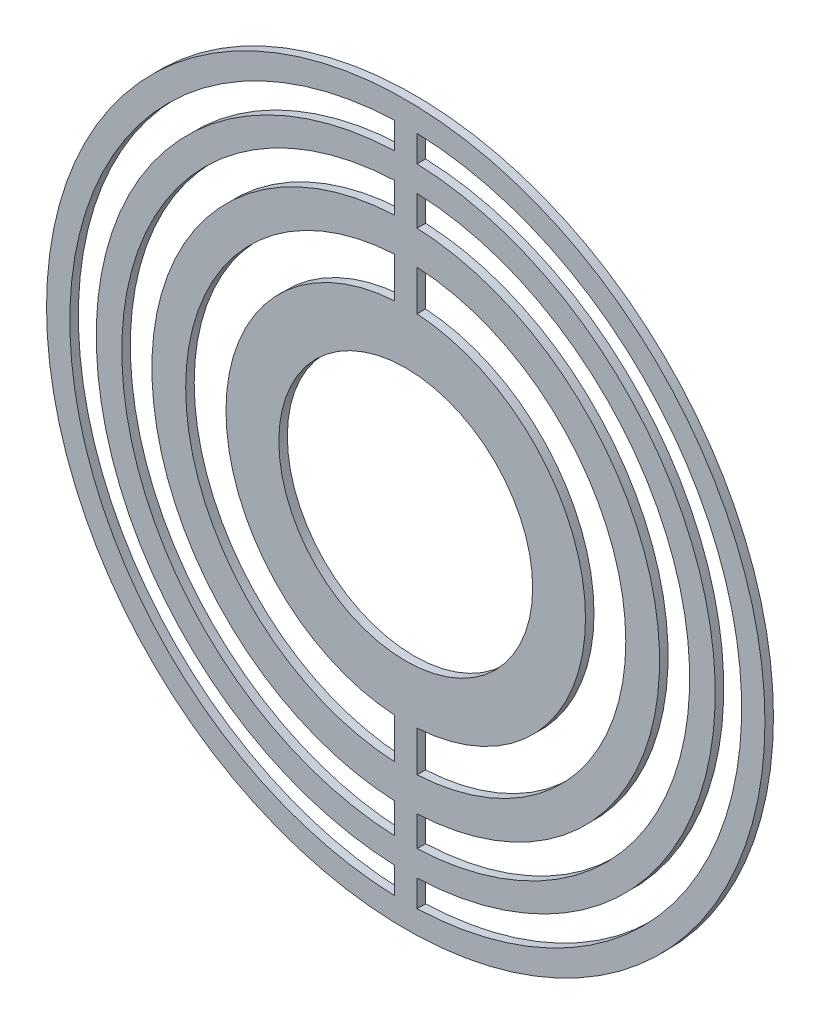
ISO-10303-21;
HEADER;
FILE_DESCRIPTION(('STEP AP214'),'2;1');
FILE_NAME('part.step','',(''),(''),'','','');
FILE_SCHEMA(('AUTOMOTIVE_DESIGN { 1 0 10303 214 1 1 1 1 }'));
ENDSEC;
DATA;
#1=APPLICATION_CONTEXT('core data for automotive mechanical design processes');
#2=APPLICATION_PROTOCOL_DEFINITION('international standard','automotive_design',2000,#1);
#3=PRODUCT_CONTEXT('',#1,'mechanical');
#4=PRODUCT('Part','Part','',(#3));
#5=PRODUCT_RELATED_PRODUCT_CATEGORY('part','',(#4));
#6=PRODUCT_DEFINITION_FORMATION('','',#4);
#7=PRODUCT_DEFINITION_CONTEXT('part definition',#1,'design');
#8=PRODUCT_DEFINITION('design','',#6,#7);
#9=PRODUCT_DEFINITION_SHAPE('','',#8);
#10=(LENGTH_UNIT() NAMED_UNIT(*) SI_UNIT(.MILLI.,.METRE.));
#11=(NAMED_UNIT(*) PLANE_ANGLE_UNIT() SI_UNIT($,.RADIAN.));
#12=(NAMED_UNIT(*) SI_UNIT($,.STERADIAN.) SOLID_ANGLE_UNIT());
#13=UNCERTAINTY_MEASURE_WITH_UNIT(LENGTH_MEASURE(1.E-05),#10,'distance_accuracy_value','');
#14=(GEOMETRIC_REPRESENTATION_CONTEXT(3) GLOBAL_UNCERTAINTY_ASSIGNED_CONTEXT((#13)) GLOBAL_UNIT_ASSIGNED_CONTEXT((#10,
#11,#12)) REPRESENTATION_CONTEXT('',''));
#15=CARTESIAN_POINT('',(0.,0.,0.));
#16=DIRECTION('',(0.,0.,1.));
#17=DIRECTION('',(1.,0.,0.));
#18=AXIS2_PLACEMENT_3D('',#15,#16,#17);
#19=CARTESIAN_POINT('',(0.,0.,3.));
#20=DIRECTION('',(0.,0.,1.));
#21=DIRECTION('',(1.,0.,0.));
#22=AXIS2_PLACEMENT_3D('',#19,#20,#21);
#23=PLANE('',#22);
#24=CARTESIAN_POINT('',(0.,0.,3.));
#25=DIRECTION('',(0.,0.,1.));
#26=DIRECTION('',(1.,0.,0.));
#27=AXIS2_PLACEMENT_3D('',#24,#25,#26);
#28=CIRCLE('',#27,126.5);
#29=CARTESIAN_POINT('',(126.5,0.,3.));
#30=VERTEX_POINT('',#29);
#31=EDGE_CURVE('E11',#30,#30,#28,.T.);
#32=ORIENTED_EDGE('',*,*,#31,.T.);
#33=EDGE_LOOP('',(#32));
#34=FACE_BOUND('',#33,.T.);
#35=CARTESIAN_POINT('',(0.,0.,3.));
#36=DIRECTION('',(0.,0.,1.));
#37=DIRECTION('',(1.,0.,0.));
#38=AXIS2_PLACEMENT_3D('',#35,#36,#37);
#39=CIRCLE('',#38,44.7);
#40=CARTESIAN_POINT('',(44.7,0.,3.));
#41=VERTEX_POINT('',#40);
#42=EDGE_CURVE('E476',#41,#41,#39,.T.);
#43=ORIENTED_EDGE('',*,*,#42,.F.);
#44=EDGE_LOOP('',(#43));
#45=FACE_BOUND('',#44,.T.);
#46=DIRECTION('',(0.,1.,0.));
#47=VECTOR('',#46,1.);
#48=CARTESIAN_POINT('',(-3.99999999999998,77.3967053562359,3.));
#49=LINE('',#48,#47);
#50=CARTESIAN_POINT('',(-3.99999999999998,63.1734912760091,3.));
#51=VERTEX_POINT('',#50);
#52=CARTESIAN_POINT('',(-3.99999999999998,77.3967053562359,3.));
#53=VERTEX_POINT('',#52);
#54=EDGE_CURVE('E436',#51,#53,#49,.T.);
#55=ORIENTED_EDGE('',*,*,#54,.F.);
#56=CARTESIAN_POINT('',(0.,0.,3.));
#57=DIRECTION('',(0.,0.,-1.));
#58=DIRECTION('',(1.,0.,0.));
#59=AXIS2_PLACEMENT_3D('',#56,#57,#58);
#60=CIRCLE('',#59,63.3);
#61=CARTESIAN_POINT('',(-3.99999999999998,-63.1734912760091,3.));
#62=VERTEX_POINT('',#61);
#63=EDGE_CURVE('E433',#62,#51,#60,.T.);
#64=ORIENTED_EDGE('',*,*,#63,.F.);
#65=DIRECTION('',(0.,1.,0.));
#66=VECTOR('',#65,1.);
#67=CARTESIAN_POINT('',(-3.99999999999998,-63.1734912760091,3.));
#68=LINE('',#67,#66);
#69=CARTESIAN_POINT('',(-3.99999999999998,-77.3967053562359,3.));
#70=VERTEX_POINT('',#69);
#71=EDGE_CURVE('E444',#70,#62,#68,.T.);
#72=ORIENTED_EDGE('',*,*,#71,.F.);
#73=CARTESIAN_POINT('',(0.,0.,3.));
#74=DIRECTION('',(0.,0.,1.));
#75=DIRECTION('',(1.,0.,0.));
#76=AXIS2_PLACEMENT_3D('',#73,#74,#75);
#77=CIRCLE('',#76,77.5);
#78=EDGE_CURVE('E440',#53,#70,#77,.T.);
#79=ORIENTED_EDGE('',*,*,#78,.F.);
#80=EDGE_LOOP('',(#55,#64,#72,#79));
#81=FACE_BOUND('',#80,.T.);
#82=DIRECTION('',(0.,-1.,0.));
#83=VECTOR('',#82,1.);
#84=CARTESIAN_POINT('',(4.00000000000001,-63.1734912760091,3.));
#85=LINE('',#84,#83);
#86=CARTESIAN_POINT('',(4.00000000000001,-63.1734912760091,3.));
#87=VERTEX_POINT('',#86);
#88=CARTESIAN_POINT('',(4.00000000000001,-77.3967053562359,3.));
#89=VERTEX_POINT('',#88);
#90=EDGE_CURVE('E393',#87,#89,#85,.T.);
#91=ORIENTED_EDGE('',*,*,#90,.F.);
#92=CARTESIAN_POINT('',(0.,0.,3.));
#93=DIRECTION('',(0.,0.,-1.));
#94=DIRECTION('',(1.,0.,0.));
#95=AXIS2_PLACEMENT_3D('',#92,#93,#94);
#96=CIRCLE('',#95,63.3);
#97=CARTESIAN_POINT('',(3.99999999999999,63.1734912760091,3.));
#98=VERTEX_POINT('',#97);
#99=EDGE_CURVE('E390',#98,#87,#96,.T.);
#100=ORIENTED_EDGE('',*,*,#99,.F.);
#101=DIRECTION('',(0.,-1.,0.));
#102=VECTOR('',#101,1.);
#103=CARTESIAN_POINT('',(3.99999999999999,77.3967053562359,3.));
#104=LINE('',#103,#102);
#105=CARTESIAN_POINT('',(3.99999999999999,77.3967053562359,3.));
#106=VERTEX_POINT('',#105);
#107=EDGE_CURVE('E401',#106,#98,#104,.T.);
#108=ORIENTED_EDGE('',*,*,#107,.F.);
#109=CARTESIAN_POINT('',(0.,0.,3.));
#110=DIRECTION('',(0.,0.,1.));
#111=DIRECTION('',(1.,0.,0.));
#112=AXIS2_PLACEMENT_3D('',#109,#110,#111);
#113=CIRCLE('',#112,77.5);
#114=EDGE_CURVE('E397',#89,#106,#113,.T.);
#115=ORIENTED_EDGE('',*,*,#114,.F.);
#116=EDGE_LOOP('',(#91,#100,#108,#115));
#117=FACE_BOUND('',#116,.T.);
#118=DIRECTION('',(0.,-1.,0.));
#119=VECTOR('',#118,1.);
#120=CARTESIAN_POINT('',(3.99999999999998,118.232355977541,3.));
#121=LINE('',#120,#119);
#122=CARTESIAN_POINT('',(3.99999999999998,118.232355977541,3.));
#123=VERTEX_POINT('',#122);
#124=CARTESIAN_POINT('',(3.99999999999999,108.926580778064,3.));
#125=VERTEX_POINT('',#124);
#126=EDGE_CURVE('E350',#123,#125,#121,.T.);
#127=ORIENTED_EDGE('',*,*,#126,.F.);
#128=CARTESIAN_POINT('',(0.,0.,3.));
#129=DIRECTION('',(0.,0.,1.));
#130=DIRECTION('',(1.,0.,0.));
#131=AXIS2_PLACEMENT_3D('',#128,#129,#130);
#132=CIRCLE('',#131,118.3);
#133=CARTESIAN_POINT('',(4.00000000000001,-118.232355977541,3.));
#134=VERTEX_POINT('',#133);
#135=EDGE_CURVE('E347',#134,#123,#132,.T.);
#136=ORIENTED_EDGE('',*,*,#135,.F.);
#137=DIRECTION('',(0.,-1.,0.));
#138=VECTOR('',#137,1.);
#139=CARTESIAN_POINT('',(4.00000000000001,-108.926580778064,3.));
#140=LINE('',#139,#138);
#141=CARTESIAN_POINT('',(4.00000000000001,-108.926580778064,3.));
#142=VERTEX_POINT('',#141);
#143=EDGE_CURVE('E358',#142,#134,#140,.T.);
#144=ORIENTED_EDGE('',*,*,#143,.F.);
#145=CARTESIAN_POINT('',(0.,0.,3.));
#146=DIRECTION('',(0.,0.,-1.));
#147=DIRECTION('',(1.,0.,0.));
#148=AXIS2_PLACEMENT_3D('',#145,#146,#147);
#149=CIRCLE('',#148,109.);
#150=EDGE_CURVE('E354',#125,#142,#149,.T.);
#151=ORIENTED_EDGE('',*,*,#150,.F.);
#152=EDGE_LOOP('',(#127,#136,#144,#151));
#153=FACE_BOUND('',#152,.T.);
#154=DIRECTION('',(0.,1.,0.));
#155=VECTOR('',#154,1.);
#156=CARTESIAN_POINT('',(-3.99999999999998,118.232355977541,3.));
#157=LINE('',#156,#155);
#158=CARTESIAN_POINT('',(-3.99999999999998,108.926580778064,3.));
#159=VERTEX_POINT('',#158);
#160=CARTESIAN_POINT('',(-3.99999999999998,118.232355977541,3.));
#161=VERTEX_POINT('',#160);
#162=EDGE_CURVE('E308',#159,#161,#157,.T.);
#163=ORIENTED_EDGE('',*,*,#162,.F.);
#164=CARTESIAN_POINT('',(0.,0.,3.));
#165=DIRECTION('',(0.,0.,-1.));
#166=DIRECTION('',(1.,0.,0.));
#167=AXIS2_PLACEMENT_3D('',#164,#165,#166);
#168=CIRCLE('',#167,109.);
#169=CARTESIAN_POINT('',(-3.99999999999998,-108.926580778064,3.));
#170=VERTEX_POINT('',#169);
#171=EDGE_CURVE('E305',#170,#159,#168,.T.);
#172=ORIENTED_EDGE('',*,*,#171,.F.);
#173=DIRECTION('',(0.,1.,0.));
#174=VECTOR('',#173,1.);
#175=CARTESIAN_POINT('',(-3.99999999999998,-108.926580778064,3.));
#176=LINE('',#175,#174);
#177=CARTESIAN_POINT('',(-3.99999999999998,-118.232355977541,3.));
#178=VERTEX_POINT('',#177);
#179=EDGE_CURVE('E315',#178,#170,#176,.T.);
#180=ORIENTED_EDGE('',*,*,#179,.F.);
#181=CARTESIAN_POINT('',(0.,0.,3.));
#182=DIRECTION('',(0.,0.,1.));
#183=DIRECTION('',(1.,0.,0.));
#184=AXIS2_PLACEMENT_3D('',#181,#182,#183);
#185=CIRCLE('',#184,118.3);
#186=EDGE_CURVE('E311',#161,#178,#185,.T.);
#187=ORIENTED_EDGE('',*,*,#186,.F.);
#188=EDGE_LOOP('',(#163,#172,#180,#187));
#189=FACE_BOUND('',#188,.T.);
#190=DIRECTION('',(0.,1.,0.));
#191=VECTOR('',#190,1.);
#192=CARTESIAN_POINT('',(-3.99999999999998,99.9199679743744,3.));
#193=LINE('',#192,#191);
#194=CARTESIAN_POINT('',(-3.99999999999998,89.3104697110031,3.));
#195=VERTEX_POINT('',#194);
#196=CARTESIAN_POINT('',(-3.99999999999998,99.9199679743744,3.));
#197=VERTEX_POINT('',#196);
#198=EDGE_CURVE('E265',#195,#197,#193,.T.);
#199=ORIENTED_EDGE('',*,*,#198,.F.);
#200=CARTESIAN_POINT('',(0.,0.,3.));
#201=DIRECTION('',(0.,0.,-1.));
#202=DIRECTION('',(1.,0.,0.));
#203=AXIS2_PLACEMENT_3D('',#200,#201,#202);
#204=CIRCLE('',#203,89.4);
#205=CARTESIAN_POINT('',(-3.99999999999998,-89.3104697110031,3.));
#206=VERTEX_POINT('',#205);
#207=EDGE_CURVE('E262',#206,#195,#204,.T.);
#208=ORIENTED_EDGE('',*,*,#207,.F.);
#209=DIRECTION('',(0.,1.,0.));
#210=VECTOR('',#209,1.);
#211=CARTESIAN_POINT('',(-3.99999999999998,-89.3104697110031,3.));
#212=LINE('',#211,#210);
#213=CARTESIAN_POINT('',(-3.99999999999998,-99.9199679743744,3.));
#214=VERTEX_POINT('',#213);
#215=EDGE_CURVE('E273',#214,#206,#212,.T.);
#216=ORIENTED_EDGE('',*,*,#215,.F.);
#217=CARTESIAN_POINT('',(0.,0.,3.));
#218=DIRECTION('',(0.,0.,1.));
#219=DIRECTION('',(1.,0.,0.));
#220=AXIS2_PLACEMENT_3D('',#217,#218,#219);
#221=CIRCLE('',#220,100.);
#222=EDGE_CURVE('E269',#197,#214,#221,.T.);
#223=ORIENTED_EDGE('',*,*,#222,.F.);
#224=EDGE_LOOP('',(#199,#208,#216,#223));
#225=FACE_BOUND('',#224,.T.);
#226=DIRECTION('',(0.,-1.,0.));
#227=VECTOR('',#226,1.);
#228=CARTESIAN_POINT('',(4.00000000000001,-89.3104697110031,3.));
#229=LINE('',#228,#227);
#230=CARTESIAN_POINT('',(4.00000000000001,-89.3104697110031,3.));
#231=VERTEX_POINT('',#230);
#232=CARTESIAN_POINT('',(4.00000000000001,-99.9199679743744,3.));
#233=VERTEX_POINT('',#232);
#234=EDGE_CURVE('E220',#231,#233,#229,.T.);
#235=ORIENTED_EDGE('',*,*,#234,.F.);
#236=CARTESIAN_POINT('',(0.,0.,3.));
#237=DIRECTION('',(0.,0.,-1.));
#238=DIRECTION('',(1.,0.,0.));
#239=AXIS2_PLACEMENT_3D('',#236,#237,#238);
#240=CIRCLE('',#239,89.4);
#241=CARTESIAN_POINT('',(3.99999999999999,89.3104697110031,3.));
#242=VERTEX_POINT('',#241);
#243=EDGE_CURVE('E211',#242,#231,#240,.T.);
#244=ORIENTED_EDGE('',*,*,#243,.F.);
#245=DIRECTION('',(0.,-1.,0.));
#246=VECTOR('',#245,1.);
#247=CARTESIAN_POINT('',(3.99999999999999,99.9199679743744,3.));
#248=LINE('',#247,#246);
#249=CARTESIAN_POINT('',(3.99999999999999,99.9199679743744,3.));
#250=VERTEX_POINT('',#249);
#251=EDGE_CURVE('E240',#250,#242,#248,.T.);
#252=ORIENTED_EDGE('',*,*,#251,.F.);
#253=CARTESIAN_POINT('',(0.,0.,3.));
#254=DIRECTION('',(0.,0.,1.));
#255=DIRECTION('',(1.,0.,0.));
#256=AXIS2_PLACEMENT_3D('',#253,#254,#255);
#257=CIRCLE('',#256,100.);
#258=EDGE_CURVE('E233',#233,#250,#257,.T.);
#259=ORIENTED_EDGE('',*,*,#258,.F.);
#260=EDGE_LOOP('',(#235,#244,#252,#259));
#261=FACE_BOUND('',#260,.T.);
#262=ADVANCED_FACE('F49',(#34,#45,#81,#117,#153,#189,#225,#261),#23,.T.);
#263=CARTESIAN_POINT('',(0.,0.,0.));
#264=DIRECTION('',(0.,0.,1.));
#265=DIRECTION('',(1.,0.,0.));
#266=AXIS2_PLACEMENT_3D('',#263,#264,#265);
#267=PLANE('',#266);
#268=CARTESIAN_POINT('',(0.,0.,0.));
#269=DIRECTION('',(0.,0.,-1.));
#270=DIRECTION('',(1.,0.,0.));
#271=AXIS2_PLACEMENT_3D('',#268,#269,#270);
#272=CIRCLE('',#271,89.4);
#273=CARTESIAN_POINT('',(-3.99999999999998,-89.3104697110031,0.));
#274=VERTEX_POINT('',#273);
#275=CARTESIAN_POINT('',(-3.99999999999998,89.3104697110031,0.));
#276=VERTEX_POINT('',#275);
#277=EDGE_CURVE('E229',#274,#276,#272,.T.);
#278=ORIENTED_EDGE('',*,*,#277,.T.);
#279=DIRECTION('',(0.,1.,0.));
#280=VECTOR('',#279,1.);
#281=CARTESIAN_POINT('',(-3.99999999999998,99.9199679743744,0.));
#282=LINE('',#281,#280);
#283=CARTESIAN_POINT('',(-3.99999999999998,99.9199679743744,0.));
#284=VERTEX_POINT('',#283);
#285=EDGE_CURVE('E280',#276,#284,#282,.T.);
#286=ORIENTED_EDGE('',*,*,#285,.T.);
#287=CARTESIAN_POINT('',(0.,0.,0.));
#288=DIRECTION('',(0.,0.,1.));
#289=DIRECTION('',(1.,0.,0.));
#290=AXIS2_PLACEMENT_3D('',#287,#288,#289);
#291=CIRCLE('',#290,100.);
#292=CARTESIAN_POINT('',(-3.99999999999998,-99.9199679743744,0.));
#293=VERTEX_POINT('',#292);
#294=EDGE_CURVE('E284',#284,#293,#291,.T.);
#295=ORIENTED_EDGE('',*,*,#294,.T.);
#296=DIRECTION('',(0.,1.,0.));
#297=VECTOR('',#296,1.);
#298=CARTESIAN_POINT('',(-3.99999999999998,-89.3104697110031,0.));
#299=LINE('',#298,#297);
#300=EDGE_CURVE('E266',#293,#274,#299,.T.);
#301=ORIENTED_EDGE('',*,*,#300,.T.);
#302=EDGE_LOOP('',(#278,#286,#295,#301));
#303=FACE_BOUND('',#302,.T.);
#304=CARTESIAN_POINT('',(0.,0.,0.));
#305=DIRECTION('',(0.,0.,1.));
#306=DIRECTION('',(1.,0.,0.));
#307=AXIS2_PLACEMENT_3D('',#304,#305,#306);
#308=CIRCLE('',#307,118.3);
#309=CARTESIAN_POINT('',(4.00000000000001,-118.232355977541,0.));
#310=VERTEX_POINT('',#309);
#311=CARTESIAN_POINT('',(3.99999999999998,118.232355977541,0.));
#312=VERTEX_POINT('',#311);
#313=EDGE_CURVE('E346',#310,#312,#308,.T.);
#314=ORIENTED_EDGE('',*,*,#313,.T.);
#315=DIRECTION('',(0.,-1.,0.));
#316=VECTOR('',#315,1.);
#317=CARTESIAN_POINT('',(3.99999999999998,118.232355977541,0.));
#318=LINE('',#317,#316);
#319=CARTESIAN_POINT('',(3.99999999999999,108.926580778064,0.));
#320=VERTEX_POINT('',#319);
#321=EDGE_CURVE('E365',#312,#320,#318,.T.);
#322=ORIENTED_EDGE('',*,*,#321,.T.);
#323=CARTESIAN_POINT('',(0.,0.,0.));
#324=DIRECTION('',(0.,0.,-1.));
#325=DIRECTION('',(1.,0.,0.));
#326=AXIS2_PLACEMENT_3D('',#323,#324,#325);
#327=CIRCLE('',#326,109.);
#328=CARTESIAN_POINT('',(3.99999999999996,-108.926580778064,0.));
#329=VERTEX_POINT('',#328);
#330=EDGE_CURVE('E369',#320,#329,#327,.T.);
#331=ORIENTED_EDGE('',*,*,#330,.T.);
#332=DIRECTION('',(0.,-1.,0.));
#333=VECTOR('',#332,1.);
#334=CARTESIAN_POINT('',(4.00000000000001,-108.926580778064,0.));
#335=LINE('',#334,#333);
#336=EDGE_CURVE('E351',#329,#310,#335,.T.);
#337=ORIENTED_EDGE('',*,*,#336,.T.);
#338=EDGE_LOOP('',(#314,#322,#331,#337));
#339=FACE_BOUND('',#338,.T.);
#340=CARTESIAN_POINT('',(0.,0.,0.));
#341=DIRECTION('',(0.,0.,-1.));
#342=DIRECTION('',(1.,0.,0.));
#343=AXIS2_PLACEMENT_3D('',#340,#341,#342);
#344=CIRCLE('',#343,63.3);
#345=CARTESIAN_POINT('',(-3.99999999999998,-63.1734912760091,0.));
#346=VERTEX_POINT('',#345);
#347=CARTESIAN_POINT('',(-3.99999999999998,63.1734912760091,0.));
#348=VERTEX_POINT('',#347);
#349=EDGE_CURVE('E432',#346,#348,#344,.T.);
#350=ORIENTED_EDGE('',*,*,#349,.T.);
#351=DIRECTION('',(0.,1.,0.));
#352=VECTOR('',#351,1.);
#353=CARTESIAN_POINT('',(-3.99999999999998,77.3967053562359,0.));
#354=LINE('',#353,#352);
#355=CARTESIAN_POINT('',(-3.99999999999998,77.3967053562359,0.));
#356=VERTEX_POINT('',#355);
#357=EDGE_CURVE('E451',#348,#356,#354,.T.);
#358=ORIENTED_EDGE('',*,*,#357,.T.);
#359=CARTESIAN_POINT('',(0.,0.,0.));
#360=DIRECTION('',(0.,0.,1.));
#361=DIRECTION('',(1.,0.,0.));
#362=AXIS2_PLACEMENT_3D('',#359,#360,#361);
#363=CIRCLE('',#362,77.5);
#364=CARTESIAN_POINT('',(-3.99999999999998,-77.3967053562359,0.));
#365=VERTEX_POINT('',#364);
#366=EDGE_CURVE('E455',#356,#365,#363,.T.);
#367=ORIENTED_EDGE('',*,*,#366,.T.);
#368=DIRECTION('',(0.,1.,0.));
#369=VECTOR('',#368,1.);
#370=CARTESIAN_POINT('',(-3.99999999999998,-63.1734912760091,0.));
#371=LINE('',#370,#369);
#372=EDGE_CURVE('E437',#365,#346,#371,.T.);
#373=ORIENTED_EDGE('',*,*,#372,.T.);
#374=EDGE_LOOP('',(#350,#358,#367,#373));
#375=FACE_BOUND('',#374,.T.);
#376=CARTESIAN_POINT('',(0.,0.,0.));
#377=DIRECTION('',(0.,0.,1.));
#378=DIRECTION('',(1.,0.,0.));
#379=AXIS2_PLACEMENT_3D('',#376,#377,#378);
#380=CIRCLE('',#379,126.5);
#381=CARTESIAN_POINT('',(126.5,0.,0.));
#382=VERTEX_POINT('',#381);
#383=EDGE_CURVE('E53',#382,#382,#380,.T.);
#384=ORIENTED_EDGE('',*,*,#383,.F.);
#385=EDGE_LOOP('',(#384));
#386=FACE_BOUND('',#385,.T.);
#387=CARTESIAN_POINT('',(0.,0.,0.));
#388=DIRECTION('',(0.,0.,1.));
#389=DIRECTION('',(1.,0.,0.));
#390=AXIS2_PLACEMENT_3D('',#387,#388,#389);
#391=CIRCLE('',#390,44.7);
#392=CARTESIAN_POINT('',(44.7,0.,0.));
#393=VERTEX_POINT('',#392);
#394=EDGE_CURVE('E475',#393,#393,#391,.T.);
#395=ORIENTED_EDGE('',*,*,#394,.T.);
#396=EDGE_LOOP('',(#395));
#397=FACE_BOUND('',#396,.T.);
#398=CARTESIAN_POINT('',(0.,0.,0.));
#399=DIRECTION('',(0.,0.,-1.));
#400=DIRECTION('',(1.,0.,0.));
#401=AXIS2_PLACEMENT_3D('',#398,#399,#400);
#402=CIRCLE('',#401,63.3);
#403=CARTESIAN_POINT('',(3.99999999999999,63.1734912760091,0.));
#404=VERTEX_POINT('',#403);
#405=CARTESIAN_POINT('',(4.00000000000001,-63.1734912760091,0.));
#406=VERTEX_POINT('',#405);
#407=EDGE_CURVE('E389',#404,#406,#402,.T.);
#408=ORIENTED_EDGE('',*,*,#407,.T.);
#409=DIRECTION('',(0.,-1.,0.));
#410=VECTOR('',#409,1.);
#411=CARTESIAN_POINT('',(4.00000000000001,-63.1734912760091,0.));
#412=LINE('',#411,#410);
#413=CARTESIAN_POINT('',(4.00000000000001,-77.3967053562359,0.));
#414=VERTEX_POINT('',#413);
#415=EDGE_CURVE('E408',#406,#414,#412,.T.);
#416=ORIENTED_EDGE('',*,*,#415,.T.);
#417=CARTESIAN_POINT('',(0.,0.,0.));
#418=DIRECTION('',(0.,0.,1.));
#419=DIRECTION('',(1.,0.,0.));
#420=AXIS2_PLACEMENT_3D('',#417,#418,#419);
#421=CIRCLE('',#420,77.5);
#422=CARTESIAN_POINT('',(3.99999999999999,77.3967053562359,0.));
#423=VERTEX_POINT('',#422);
#424=EDGE_CURVE('E412',#414,#423,#421,.T.);
#425=ORIENTED_EDGE('',*,*,#424,.T.);
#426=DIRECTION('',(0.,-1.,0.));
#427=VECTOR('',#426,1.);
#428=CARTESIAN_POINT('',(3.99999999999999,77.3967053562359,0.));
#429=LINE('',#428,#427);
#430=EDGE_CURVE('E394',#423,#404,#429,.T.);
#431=ORIENTED_EDGE('',*,*,#430,.T.);
#432=EDGE_LOOP('',(#408,#416,#425,#431));
#433=FACE_BOUND('',#432,.T.);
#434=CARTESIAN_POINT('',(0.,0.,0.));
#435=DIRECTION('',(0.,0.,-1.));
#436=DIRECTION('',(1.,0.,0.));
#437=AXIS2_PLACEMENT_3D('',#434,#435,#436);
#438=CIRCLE('',#437,109.);
#439=CARTESIAN_POINT('',(-3.99999999999998,-108.926580778064,0.));
#440=VERTEX_POINT('',#439);
#441=CARTESIAN_POINT('',(-3.99999999999998,108.926580778064,0.));
#442=VERTEX_POINT('',#441);
#443=EDGE_CURVE('E304',#440,#442,#438,.T.);
#444=ORIENTED_EDGE('',*,*,#443,.T.);
#445=DIRECTION('',(0.,1.,0.));
#446=VECTOR('',#445,1.);
#447=CARTESIAN_POINT('',(-3.99999999999998,118.232355977541,0.));
#448=LINE('',#447,#446);
#449=CARTESIAN_POINT('',(-3.99999999999998,118.232355977541,0.));
#450=VERTEX_POINT('',#449);
#451=EDGE_CURVE('E322',#442,#450,#448,.T.);
#452=ORIENTED_EDGE('',*,*,#451,.T.);
#453=CARTESIAN_POINT('',(0.,0.,0.));
#454=DIRECTION('',(0.,0.,1.));
#455=DIRECTION('',(1.,0.,0.));
#456=AXIS2_PLACEMENT_3D('',#453,#454,#455);
#457=CIRCLE('',#456,118.3);
#458=CARTESIAN_POINT('',(-4.,-118.232355977541,0.));
#459=VERTEX_POINT('',#458);
#460=EDGE_CURVE('E326',#450,#459,#457,.T.);
#461=ORIENTED_EDGE('',*,*,#460,.T.);
#462=DIRECTION('',(0.,1.,0.));
#463=VECTOR('',#462,1.);
#464=CARTESIAN_POINT('',(-3.99999999999998,-108.926580778064,0.));
#465=LINE('',#464,#463);
#466=EDGE_CURVE('E309',#459,#440,#465,.T.);
#467=ORIENTED_EDGE('',*,*,#466,.T.);
#468=EDGE_LOOP('',(#444,#452,#461,#467));
#469=FACE_BOUND('',#468,.T.);
#470=CARTESIAN_POINT('',(0.,0.,0.));
#471=DIRECTION('',(0.,0.,-1.));
#472=DIRECTION('',(1.,0.,0.));
#473=AXIS2_PLACEMENT_3D('',#470,#471,#472);
#474=CIRCLE('',#473,89.4);
#475=CARTESIAN_POINT('',(3.99999999999999,89.3104697110031,0.));
#476=VERTEX_POINT('',#475);
#477=CARTESIAN_POINT('',(4.00000000000001,-89.3104697110031,0.));
#478=VERTEX_POINT('',#477);
#479=EDGE_CURVE('E73',#476,#478,#474,.T.);
#480=ORIENTED_EDGE('',*,*,#479,.T.);
#481=DIRECTION('',(0.,-1.,0.));
#482=VECTOR('',#481,1.);
#483=CARTESIAN_POINT('',(4.00000000000001,-89.3104697110031,0.));
#484=LINE('',#483,#482);
#485=CARTESIAN_POINT('',(4.00000000000001,-99.9199679743744,0.));
#486=VERTEX_POINT('',#485);
#487=EDGE_CURVE('E227',#478,#486,#484,.T.);
#488=ORIENTED_EDGE('',*,*,#487,.T.);
#489=CARTESIAN_POINT('',(0.,0.,0.));
#490=DIRECTION('',(0.,0.,1.));
#491=DIRECTION('',(1.,0.,0.));
#492=AXIS2_PLACEMENT_3D('',#489,#490,#491);
#493=CIRCLE('',#492,100.);
#494=CARTESIAN_POINT('',(3.99999999999995,99.9199679743744,0.));
#495=VERTEX_POINT('',#494);
#496=EDGE_CURVE('E249',#486,#495,#493,.T.);
#497=ORIENTED_EDGE('',*,*,#496,.T.);
#498=DIRECTION('',(0.,-1.,0.));
#499=VECTOR('',#498,1.);
#500=CARTESIAN_POINT('',(3.99999999999999,99.9199679743744,0.));
#501=LINE('',#500,#499);
#502=EDGE_CURVE('E221',#495,#476,#501,.T.);
#503=ORIENTED_EDGE('',*,*,#502,.T.);
#504=EDGE_LOOP('',(#480,#488,#497,#503));
#505=FACE_BOUND('',#504,.T.);
#506=ADVANCED_FACE('F485',(#303,#339,#375,#386,#397,#433,#469,#505),#267,.F.);
#507=CARTESIAN_POINT('',(0.,0.,3.));
#508=DIRECTION('',(0.,0.,-1.));
#509=DIRECTION('',(-1.,0.,0.));
#510=AXIS2_PLACEMENT_3D('',#507,#508,#509);
#511=CYLINDRICAL_SURFACE('',#510,126.5);
#512=ORIENTED_EDGE('',*,*,#31,.F.);
#513=EDGE_LOOP('',(#512));
#514=FACE_BOUND('',#513,.T.);
#515=ORIENTED_EDGE('',*,*,#383,.T.);
#516=EDGE_LOOP('',(#515));
#517=FACE_BOUND('',#516,.T.);
#518=ADVANCED_FACE('F51',(#514,#517),#511,.T.);
#519=CARTESIAN_POINT('',(0.,0.,3.));
#520=DIRECTION('',(0.,0.,-1.));
#521=DIRECTION('',(-1.,0.,0.));
#522=AXIS2_PLACEMENT_3D('',#519,#520,#521);
#523=CYLINDRICAL_SURFACE('',#522,44.7);
#524=ORIENTED_EDGE('',*,*,#42,.T.);
#525=EDGE_LOOP('',(#524));
#526=FACE_BOUND('',#525,.T.);
#527=ORIENTED_EDGE('',*,*,#394,.F.);
#528=EDGE_LOOP('',(#527));
#529=FACE_BOUND('',#528,.T.);
#530=ADVANCED_FACE('F488',(#526,#529),#523,.F.);
#531=CARTESIAN_POINT('',(0.,0.,3.));
#532=DIRECTION('',(0.,0.,-1.));
#533=DIRECTION('',(-1.,0.,0.));
#534=AXIS2_PLACEMENT_3D('',#531,#532,#533);
#535=CYLINDRICAL_SURFACE('',#534,63.3);
#536=ORIENTED_EDGE('',*,*,#349,.F.);
#537=DIRECTION('',(0.,0.,-1.));
#538=VECTOR('',#537,1.);
#539=CARTESIAN_POINT('',(-3.99999999999998,-63.1734912760091,3.));
#540=LINE('',#539,#538);
#541=EDGE_CURVE('E447',#62,#346,#540,.T.);
#542=ORIENTED_EDGE('',*,*,#541,.F.);
#543=ORIENTED_EDGE('',*,*,#63,.T.);
#544=DIRECTION('',(0.,0.,-1.));
#545=VECTOR('',#544,1.);
#546=CARTESIAN_POINT('',(-3.99999999999998,63.1734912760091,3.));
#547=LINE('',#546,#545);
#548=EDGE_CURVE('E471',#51,#348,#547,.T.);
#549=ORIENTED_EDGE('',*,*,#548,.T.);
#550=EDGE_LOOP('',(#536,#542,#543,#549));
#551=FACE_BOUND('',#550,.T.);
#552=ADVANCED_FACE('F490',(#551),#535,.T.);
#553=CARTESIAN_POINT('',(-3.99999999999998,77.3967053562359,3.));
#554=DIRECTION('',(-1.,0.,0.));
#555=DIRECTION('',(0.,-1.,0.));
#556=AXIS2_PLACEMENT_3D('',#553,#554,#555);
#557=PLANE('',#556);
#558=ORIENTED_EDGE('',*,*,#357,.F.);
#559=ORIENTED_EDGE('',*,*,#548,.F.);
#560=ORIENTED_EDGE('',*,*,#54,.T.);
#561=DIRECTION('',(0.,0.,-1.));
#562=VECTOR('',#561,1.);
#563=CARTESIAN_POINT('',(-3.99999999999998,77.3967053562359,3.));
#564=LINE('',#563,#562);
#565=EDGE_CURVE('E468',#53,#356,#564,.T.);
#566=ORIENTED_EDGE('',*,*,#565,.T.);
#567=EDGE_LOOP('',(#558,#559,#560,#566));
#568=FACE_BOUND('',#567,.T.);
#569=ADVANCED_FACE('F496',(#568),#557,.T.);
#570=CARTESIAN_POINT('',(0.,0.,3.));
#571=DIRECTION('',(0.,0.,-1.));
#572=DIRECTION('',(-1.,0.,0.));
#573=AXIS2_PLACEMENT_3D('',#570,#571,#572);
#574=CYLINDRICAL_SURFACE('',#573,77.5);
#575=ORIENTED_EDGE('',*,*,#366,.F.);
#576=ORIENTED_EDGE('',*,*,#565,.F.);
#577=ORIENTED_EDGE('',*,*,#78,.T.);
#578=DIRECTION('',(0.,0.,-1.));
#579=VECTOR('',#578,1.);
#580=CARTESIAN_POINT('',(-3.99999999999998,-77.3967053562359,3.));
#581=LINE('',#580,#579);
#582=EDGE_CURVE('E465',#70,#365,#581,.T.);
#583=ORIENTED_EDGE('',*,*,#582,.T.);
#584=EDGE_LOOP('',(#575,#576,#577,#583));
#585=FACE_BOUND('',#584,.T.);
#586=ADVANCED_FACE('F608',(#585),#574,.F.);
#587=CARTESIAN_POINT('',(-3.99999999999998,-63.1734912760091,3.));
#588=DIRECTION('',(-1.,0.,0.));
#589=DIRECTION('',(0.,0.,1.));
#590=AXIS2_PLACEMENT_3D('',#587,#588,#589);
#591=PLANE('',#590);
#592=ORIENTED_EDGE('',*,*,#372,.F.);
#593=ORIENTED_EDGE('',*,*,#582,.F.);
#594=ORIENTED_EDGE('',*,*,#71,.T.);
#595=ORIENTED_EDGE('',*,*,#541,.T.);
#596=EDGE_LOOP('',(#592,#593,#594,#595));
#597=FACE_BOUND('',#596,.T.);
#598=ADVANCED_FACE('F604',(#597),#591,.T.);
#599=CARTESIAN_POINT('',(0.,0.,3.));
#600=DIRECTION('',(0.,0.,-1.));
#601=DIRECTION('',(-1.,0.,0.));
#602=AXIS2_PLACEMENT_3D('',#599,#600,#601);
#603=CYLINDRICAL_SURFACE('',#602,63.3);
#604=ORIENTED_EDGE('',*,*,#407,.F.);
#605=DIRECTION('',(0.,0.,-1.));
#606=VECTOR('',#605,1.);
#607=CARTESIAN_POINT('',(3.99999999999999,63.1734912760091,3.));
#608=LINE('',#607,#606);
#609=EDGE_CURVE('E404',#98,#404,#608,.T.);
#610=ORIENTED_EDGE('',*,*,#609,.F.);
#611=ORIENTED_EDGE('',*,*,#99,.T.);
#612=DIRECTION('',(0.,0.,-1.));
#613=VECTOR('',#612,1.);
#614=CARTESIAN_POINT('',(4.00000000000001,-63.1734912760091,3.));
#615=LINE('',#614,#613);
#616=EDGE_CURVE('E428',#87,#406,#615,.T.);
#617=ORIENTED_EDGE('',*,*,#616,.T.);
#618=EDGE_LOOP('',(#604,#610,#611,#617));
#619=FACE_BOUND('',#618,.T.);
#620=ADVANCED_FACE('F600',(#619),#603,.T.);
#621=CARTESIAN_POINT('',(4.00000000000001,-63.1734912760091,3.));
#622=DIRECTION('',(1.,0.,0.));
#623=DIRECTION('',(0.,1.,0.));
#624=AXIS2_PLACEMENT_3D('',#621,#622,#623);
#625=PLANE('',#624);
#626=ORIENTED_EDGE('',*,*,#415,.F.);
#627=ORIENTED_EDGE('',*,*,#616,.F.);
#628=ORIENTED_EDGE('',*,*,#90,.T.);
#629=DIRECTION('',(0.,0.,-1.));
#630=VECTOR('',#629,1.);
#631=CARTESIAN_POINT('',(4.00000000000001,-77.3967053562359,3.));
#632=LINE('',#631,#630);
#633=EDGE_CURVE('E425',#89,#414,#632,.T.);
#634=ORIENTED_EDGE('',*,*,#633,.T.);
#635=EDGE_LOOP('',(#626,#627,#628,#634));
#636=FACE_BOUND('',#635,.T.);
#637=ADVANCED_FACE('F596',(#636),#625,.T.);
#638=CARTESIAN_POINT('',(0.,0.,3.));
#639=DIRECTION('',(0.,0.,-1.));
#640=DIRECTION('',(-1.,0.,0.));
#641=AXIS2_PLACEMENT_3D('',#638,#639,#640);
#642=CYLINDRICAL_SURFACE('',#641,77.5);
#643=ORIENTED_EDGE('',*,*,#424,.F.);
#644=ORIENTED_EDGE('',*,*,#633,.F.);
#645=ORIENTED_EDGE('',*,*,#114,.T.);
#646=DIRECTION('',(0.,0.,-1.));
#647=VECTOR('',#646,1.);
#648=CARTESIAN_POINT('',(3.99999999999999,77.3967053562359,3.));
#649=LINE('',#648,#647);
#650=EDGE_CURVE('E422',#106,#423,#649,.T.);
#651=ORIENTED_EDGE('',*,*,#650,.T.);
#652=EDGE_LOOP('',(#643,#644,#645,#651));
#653=FACE_BOUND('',#652,.T.);
#654=ADVANCED_FACE('F592',(#653),#642,.F.);
#655=CARTESIAN_POINT('',(3.99999999999999,77.3967053562359,3.));
#656=DIRECTION('',(1.,0.,0.));
#657=DIRECTION('',(0.,1.,0.));
#658=AXIS2_PLACEMENT_3D('',#655,#656,#657);
#659=PLANE('',#658);
#660=ORIENTED_EDGE('',*,*,#430,.F.);
#661=ORIENTED_EDGE('',*,*,#650,.F.);
#662=ORIENTED_EDGE('',*,*,#107,.T.);
#663=ORIENTED_EDGE('',*,*,#609,.T.);
#664=EDGE_LOOP('',(#660,#661,#662,#663));
#665=FACE_BOUND('',#664,.T.);
#666=ADVANCED_FACE('F588',(#665),#659,.T.);
#667=CARTESIAN_POINT('',(0.,0.,3.));
#668=DIRECTION('',(0.,0.,-1.));
#669=DIRECTION('',(-1.,0.,0.));
#670=AXIS2_PLACEMENT_3D('',#667,#668,#669);
#671=CYLINDRICAL_SURFACE('',#670,118.3);
#672=ORIENTED_EDGE('',*,*,#313,.F.);
#673=DIRECTION('',(0.,0.,-1.));
#674=VECTOR('',#673,1.);
#675=CARTESIAN_POINT('',(4.00000000000001,-118.232355977541,3.));
#676=LINE('',#675,#674);
#677=EDGE_CURVE('E361',#134,#310,#676,.T.);
#678=ORIENTED_EDGE('',*,*,#677,.F.);
#679=ORIENTED_EDGE('',*,*,#135,.T.);
#680=DIRECTION('',(0.,0.,-1.));
#681=VECTOR('',#680,1.);
#682=CARTESIAN_POINT('',(3.99999999999998,118.232355977541,3.));
#683=LINE('',#682,#681);
#684=EDGE_CURVE('E385',#123,#312,#683,.T.);
#685=ORIENTED_EDGE('',*,*,#684,.T.);
#686=EDGE_LOOP('',(#672,#678,#679,#685));
#687=FACE_BOUND('',#686,.T.);
#688=ADVANCED_FACE('F584',(#687),#671,.F.);
#689=CARTESIAN_POINT('',(3.99999999999998,118.232355977541,3.));
#690=DIRECTION('',(1.,0.,0.));
#691=DIRECTION('',(0.,1.,0.));
#692=AXIS2_PLACEMENT_3D('',#689,#690,#691);
#693=PLANE('',#692);
#694=ORIENTED_EDGE('',*,*,#321,.F.);
#695=ORIENTED_EDGE('',*,*,#684,.F.);
#696=ORIENTED_EDGE('',*,*,#126,.T.);
#697=DIRECTION('',(0.,0.,-1.));
#698=VECTOR('',#697,1.);
#699=CARTESIAN_POINT('',(3.99999999999999,108.926580778064,3.));
#700=LINE('',#699,#698);
#701=EDGE_CURVE('E382',#125,#320,#700,.T.);
#702=ORIENTED_EDGE('',*,*,#701,.T.);
#703=EDGE_LOOP('',(#694,#695,#696,#702));
#704=FACE_BOUND('',#703,.T.);
#705=ADVANCED_FACE('F580',(#704),#693,.T.);
#706=CARTESIAN_POINT('',(0.,0.,3.));
#707=DIRECTION('',(0.,0.,-1.));
#708=DIRECTION('',(-1.,0.,0.));
#709=AXIS2_PLACEMENT_3D('',#706,#707,#708);
#710=CYLINDRICAL_SURFACE('',#709,109.);
#711=ORIENTED_EDGE('',*,*,#330,.F.);
#712=ORIENTED_EDGE('',*,*,#701,.F.);
#713=ORIENTED_EDGE('',*,*,#150,.T.);
#714=DIRECTION('',(0.,0.,-1.));
#715=VECTOR('',#714,1.);
#716=CARTESIAN_POINT('',(3.99999999999996,-108.926580778064,3.));
#717=LINE('',#716,#715);
#718=EDGE_CURVE('E379',#142,#329,#717,.T.);
#719=ORIENTED_EDGE('',*,*,#718,.T.);
#720=EDGE_LOOP('',(#711,#712,#713,#719));
#721=FACE_BOUND('',#720,.T.);
#722=ADVANCED_FACE('F576',(#721),#710,.T.);
#723=CARTESIAN_POINT('',(4.00000000000001,-108.926580778064,3.));
#724=DIRECTION('',(1.,0.,0.));
#725=DIRECTION('',(0.,1.,0.));
#726=AXIS2_PLACEMENT_3D('',#723,#724,#725);
#727=PLANE('',#726);
#728=ORIENTED_EDGE('',*,*,#336,.F.);
#729=ORIENTED_EDGE('',*,*,#718,.F.);
#730=ORIENTED_EDGE('',*,*,#143,.T.);
#731=ORIENTED_EDGE('',*,*,#677,.T.);
#732=EDGE_LOOP('',(#728,#729,#730,#731));
#733=FACE_BOUND('',#732,.T.);
#734=ADVANCED_FACE('F572',(#733),#727,.T.);
#735=CARTESIAN_POINT('',(0.,0.,3.));
#736=DIRECTION('',(0.,0.,-1.));
#737=DIRECTION('',(-1.,0.,0.));
#738=AXIS2_PLACEMENT_3D('',#735,#736,#737);
#739=CYLINDRICAL_SURFACE('',#738,109.);
#740=ORIENTED_EDGE('',*,*,#443,.F.);
#741=DIRECTION('',(0.,0.,-1.));
#742=VECTOR('',#741,1.);
#743=CARTESIAN_POINT('',(-3.99999999999998,-108.926580778064,3.));
#744=LINE('',#743,#742);
#745=EDGE_CURVE('E318',#170,#440,#744,.T.);
#746=ORIENTED_EDGE('',*,*,#745,.F.);
#747=ORIENTED_EDGE('',*,*,#171,.T.);
#748=DIRECTION('',(0.,0.,-1.));
#749=VECTOR('',#748,1.);
#750=CARTESIAN_POINT('',(-3.99999999999998,108.926580778064,3.));
#751=LINE('',#750,#749);
#752=EDGE_CURVE('E342',#159,#442,#751,.T.);
#753=ORIENTED_EDGE('',*,*,#752,.T.);
#754=EDGE_LOOP('',(#740,#746,#747,#753));
#755=FACE_BOUND('',#754,.T.);
#756=ADVANCED_FACE('F568',(#755),#739,.T.);
#757=CARTESIAN_POINT('',(-3.99999999999998,118.232355977541,3.));
#758=DIRECTION('',(-1.,0.,0.));
#759=DIRECTION('',(0.,-1.,0.));
#760=AXIS2_PLACEMENT_3D('',#757,#758,#759);
#761=PLANE('',#760);
#762=ORIENTED_EDGE('',*,*,#451,.F.);
#763=ORIENTED_EDGE('',*,*,#752,.F.);
#764=ORIENTED_EDGE('',*,*,#162,.T.);
#765=DIRECTION('',(0.,0.,-1.));
#766=VECTOR('',#765,1.);
#767=CARTESIAN_POINT('',(-3.99999999999998,118.232355977541,3.));
#768=LINE('',#767,#766);
#769=EDGE_CURVE('E339',#161,#450,#768,.T.);
#770=ORIENTED_EDGE('',*,*,#769,.T.);
#771=EDGE_LOOP('',(#762,#763,#764,#770));
#772=FACE_BOUND('',#771,.T.);
#773=ADVANCED_FACE('F564',(#772),#761,.T.);
#774=CARTESIAN_POINT('',(0.,0.,3.));
#775=DIRECTION('',(0.,0.,-1.));
#776=DIRECTION('',(-1.,0.,0.));
#777=AXIS2_PLACEMENT_3D('',#774,#775,#776);
#778=CYLINDRICAL_SURFACE('',#777,118.3);
#779=ORIENTED_EDGE('',*,*,#460,.F.);
#780=ORIENTED_EDGE('',*,*,#769,.F.);
#781=ORIENTED_EDGE('',*,*,#186,.T.);
#782=DIRECTION('',(0.,0.,-1.));
#783=VECTOR('',#782,1.);
#784=CARTESIAN_POINT('',(-4.,-118.232355977541,3.));
#785=LINE('',#784,#783);
#786=EDGE_CURVE('E336',#178,#459,#785,.T.);
#787=ORIENTED_EDGE('',*,*,#786,.T.);
#788=EDGE_LOOP('',(#779,#780,#781,#787));
#789=FACE_BOUND('',#788,.T.);
#790=ADVANCED_FACE('F560',(#789),#778,.F.);
#791=CARTESIAN_POINT('',(-3.99999999999998,-108.926580778064,3.));
#792=DIRECTION('',(-1.,0.,0.));
#793=DIRECTION('',(0.,0.,1.));
#794=AXIS2_PLACEMENT_3D('',#791,#792,#793);
#795=PLANE('',#794);
#796=ORIENTED_EDGE('',*,*,#466,.F.);
#797=ORIENTED_EDGE('',*,*,#786,.F.);
#798=ORIENTED_EDGE('',*,*,#179,.T.);
#799=ORIENTED_EDGE('',*,*,#745,.T.);
#800=EDGE_LOOP('',(#796,#797,#798,#799));
#801=FACE_BOUND('',#800,.T.);
#802=ADVANCED_FACE('F557',(#801),#795,.T.);
#803=CARTESIAN_POINT('',(0.,0.,3.));
#804=DIRECTION('',(0.,0.,-1.));
#805=DIRECTION('',(-1.,0.,0.));
#806=AXIS2_PLACEMENT_3D('',#803,#804,#805);
#807=CYLINDRICAL_SURFACE('',#806,89.4);
#808=ORIENTED_EDGE('',*,*,#277,.F.);
#809=DIRECTION('',(0.,0.,-1.));
#810=VECTOR('',#809,1.);
#811=CARTESIAN_POINT('',(-3.99999999999998,-89.3104697110031,3.));
#812=LINE('',#811,#810);
#813=EDGE_CURVE('E276',#206,#274,#812,.T.);
#814=ORIENTED_EDGE('',*,*,#813,.F.);
#815=ORIENTED_EDGE('',*,*,#207,.T.);
#816=DIRECTION('',(0.,0.,-1.));
#817=VECTOR('',#816,1.);
#818=CARTESIAN_POINT('',(-3.99999999999998,89.3104697110031,3.));
#819=LINE('',#818,#817);
#820=EDGE_CURVE('E300',#195,#276,#819,.T.);
#821=ORIENTED_EDGE('',*,*,#820,.T.);
#822=EDGE_LOOP('',(#808,#814,#815,#821));
#823=FACE_BOUND('',#822,.T.);
#824=ADVANCED_FACE('F540',(#823),#807,.T.);
#825=CARTESIAN_POINT('',(-3.99999999999998,99.9199679743744,3.));
#826=DIRECTION('',(-1.,0.,0.));
#827=DIRECTION('',(0.,-1.,0.));
#828=AXIS2_PLACEMENT_3D('',#825,#826,#827);
#829=PLANE('',#828);
#830=ORIENTED_EDGE('',*,*,#285,.F.);
#831=ORIENTED_EDGE('',*,*,#820,.F.);
#832=ORIENTED_EDGE('',*,*,#198,.T.);
#833=DIRECTION('',(0.,0.,-1.));
#834=VECTOR('',#833,1.);
#835=CARTESIAN_POINT('',(-3.99999999999998,99.9199679743744,3.));
#836=LINE('',#835,#834);
#837=EDGE_CURVE('E297',#197,#284,#836,.T.);
#838=ORIENTED_EDGE('',*,*,#837,.T.);
#839=EDGE_LOOP('',(#830,#831,#832,#838));
#840=FACE_BOUND('',#839,.T.);
#841=ADVANCED_FACE('F533',(#840),#829,.T.);
#842=CARTESIAN_POINT('',(0.,0.,3.));
#843=DIRECTION('',(0.,0.,-1.));
#844=DIRECTION('',(-1.,0.,0.));
#845=AXIS2_PLACEMENT_3D('',#842,#843,#844);
#846=CYLINDRICAL_SURFACE('',#845,100.);
#847=ORIENTED_EDGE('',*,*,#294,.F.);
#848=ORIENTED_EDGE('',*,*,#837,.F.);
#849=ORIENTED_EDGE('',*,*,#222,.T.);
#850=DIRECTION('',(0.,0.,-1.));
#851=VECTOR('',#850,1.);
#852=CARTESIAN_POINT('',(-3.99999999999998,-99.9199679743744,3.));
#853=LINE('',#852,#851);
#854=EDGE_CURVE('E294',#214,#293,#853,.T.);
#855=ORIENTED_EDGE('',*,*,#854,.T.);
#856=EDGE_LOOP('',(#847,#848,#849,#855));
#857=FACE_BOUND('',#856,.T.);
#858=ADVANCED_FACE('F536',(#857),#846,.F.);
#859=CARTESIAN_POINT('',(-3.99999999999998,-89.3104697110031,3.));
#860=DIRECTION('',(-1.,0.,0.));
#861=DIRECTION('',(0.,0.,1.));
#862=AXIS2_PLACEMENT_3D('',#859,#860,#861);
#863=PLANE('',#862);
#864=ORIENTED_EDGE('',*,*,#300,.F.);
#865=ORIENTED_EDGE('',*,*,#854,.F.);
#866=ORIENTED_EDGE('',*,*,#215,.T.);
#867=ORIENTED_EDGE('',*,*,#813,.T.);
#868=EDGE_LOOP('',(#864,#865,#866,#867));
#869=FACE_BOUND('',#868,.T.);
#870=ADVANCED_FACE('F543',(#869),#863,.T.);
#871=CARTESIAN_POINT('',(0.,0.,3.));
#872=DIRECTION('',(0.,0.,-1.));
#873=DIRECTION('',(-1.,0.,0.));
#874=AXIS2_PLACEMENT_3D('',#871,#872,#873);
#875=CYLINDRICAL_SURFACE('',#874,89.4);
#876=ORIENTED_EDGE('',*,*,#479,.F.);
#877=DIRECTION('',(0.,0.,-1.));
#878=VECTOR('',#877,1.);
#879=CARTESIAN_POINT('',(3.99999999999999,89.3104697110031,3.));
#880=LINE('',#879,#878);
#881=EDGE_CURVE('E215',#242,#476,#880,.T.);
#882=ORIENTED_EDGE('',*,*,#881,.F.);
#883=ORIENTED_EDGE('',*,*,#243,.T.);
#884=DIRECTION('',(0.,0.,-1.));
#885=VECTOR('',#884,1.);
#886=CARTESIAN_POINT('',(4.00000000000001,-89.3104697110031,3.));
#887=LINE('',#886,#885);
#888=EDGE_CURVE('E214',#231,#478,#887,.T.);
#889=ORIENTED_EDGE('',*,*,#888,.T.);
#890=EDGE_LOOP('',(#876,#882,#883,#889));
#891=FACE_BOUND('',#890,.T.);
#892=ADVANCED_FACE('F213',(#891),#875,.T.);
#893=CARTESIAN_POINT('',(4.00000000000001,-89.3104697110031,3.));
#894=DIRECTION('',(1.,0.,0.));
#895=DIRECTION('',(0.,1.,0.));
#896=AXIS2_PLACEMENT_3D('',#893,#894,#895);
#897=PLANE('',#896);
#898=ORIENTED_EDGE('',*,*,#487,.F.);
#899=ORIENTED_EDGE('',*,*,#888,.F.);
#900=ORIENTED_EDGE('',*,*,#234,.T.);
#901=DIRECTION('',(0.,0.,-1.));
#902=VECTOR('',#901,1.);
#903=CARTESIAN_POINT('',(4.00000000000001,-99.9199679743744,3.));
#904=LINE('',#903,#902);
#905=EDGE_CURVE('E230',#233,#486,#904,.T.);
#906=ORIENTED_EDGE('',*,*,#905,.T.);
#907=EDGE_LOOP('',(#898,#899,#900,#906));
#908=FACE_BOUND('',#907,.T.);
#909=ADVANCED_FACE('F224',(#908),#897,.T.);
#910=CARTESIAN_POINT('',(0.,0.,3.));
#911=DIRECTION('',(0.,0.,-1.));
#912=DIRECTION('',(-1.,0.,0.));
#913=AXIS2_PLACEMENT_3D('',#910,#911,#912);
#914=CYLINDRICAL_SURFACE('',#913,100.);
#915=ORIENTED_EDGE('',*,*,#496,.F.);
#916=ORIENTED_EDGE('',*,*,#905,.F.);
#917=ORIENTED_EDGE('',*,*,#258,.T.);
#918=DIRECTION('',(0.,0.,-1.));
#919=VECTOR('',#918,1.);
#920=CARTESIAN_POINT('',(3.99999999999995,99.9199679743744,3.));
#921=LINE('',#920,#919);
#922=EDGE_CURVE('E65',#250,#495,#921,.T.);
#923=ORIENTED_EDGE('',*,*,#922,.T.);
#924=EDGE_LOOP('',(#915,#916,#917,#923));
#925=FACE_BOUND('',#924,.T.);
#926=ADVANCED_FACE('F774',(#925),#914,.F.);
#927=CARTESIAN_POINT('',(3.99999999999999,99.9199679743744,3.));
#928=DIRECTION('',(1.,0.,0.));
#929=DIRECTION('',(0.,1.,0.));
#930=AXIS2_PLACEMENT_3D('',#927,#928,#929);
#931=PLANE('',#930);
#932=ORIENTED_EDGE('',*,*,#502,.F.);
#933=ORIENTED_EDGE('',*,*,#922,.F.);
#934=ORIENTED_EDGE('',*,*,#251,.T.);
#935=ORIENTED_EDGE('',*,*,#881,.T.);
#936=EDGE_LOOP('',(#932,#933,#934,#935));
#937=FACE_BOUND('',#936,.T.);
#938=ADVANCED_FACE('F782',(#937),#931,.T.);
#939=CLOSED_SHELL('',(#262,#506,#518,#530,#552,#569,#586,#598,#620,#637,#654,#666,#688,#705,
#722,#734,#756,#773,#790,#802,#824,#841,#858,#870,#892,#909,#926,#938));
#940=MANIFOLD_SOLID_BREP('B2',#939);
#941=ADVANCED_BREP_SHAPE_REPRESENTATION('',(#18,#940),#14);
#942=SHAPE_DEFINITION_REPRESENTATION(#9,#941);
ENDSEC;
END-ISO-10303-21;
